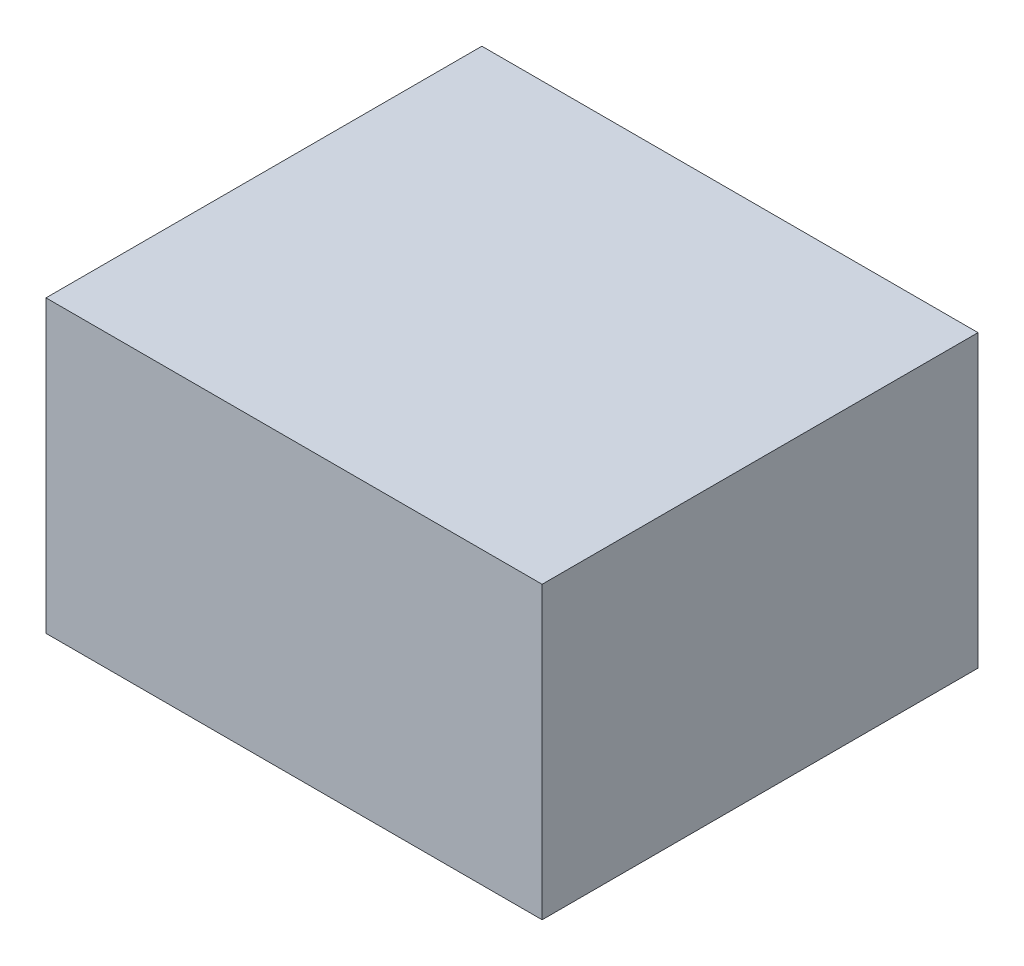
ISO-10303-21;
HEADER;
FILE_DESCRIPTION(('STEP AP214'),'2;1');
FILE_NAME('part.step','',(''),(''),'','','');
FILE_SCHEMA(('AUTOMOTIVE_DESIGN { 1 0 10303 214 1 1 1 1 }'));
ENDSEC;
DATA;
#1=APPLICATION_CONTEXT('core data for automotive mechanical design processes');
#2=APPLICATION_PROTOCOL_DEFINITION('international standard','automotive_design',2000,#1);
#3=PRODUCT_CONTEXT('',#1,'mechanical');
#4=PRODUCT('Part','Part','',(#3));
#5=PRODUCT_RELATED_PRODUCT_CATEGORY('part','',(#4));
#6=PRODUCT_DEFINITION_FORMATION('','',#4);
#7=PRODUCT_DEFINITION_CONTEXT('part definition',#1,'design');
#8=PRODUCT_DEFINITION('design','',#6,#7);
#9=PRODUCT_DEFINITION_SHAPE('','',#8);
#10=(LENGTH_UNIT() NAMED_UNIT(*) SI_UNIT(.MILLI.,.METRE.));
#11=(NAMED_UNIT(*) PLANE_ANGLE_UNIT() SI_UNIT($,.RADIAN.));
#12=(NAMED_UNIT(*) SI_UNIT($,.STERADIAN.) SOLID_ANGLE_UNIT());
#13=UNCERTAINTY_MEASURE_WITH_UNIT(LENGTH_MEASURE(1.E-05),#10,'distance_accuracy_value','');
#14=(GEOMETRIC_REPRESENTATION_CONTEXT(3) GLOBAL_UNCERTAINTY_ASSIGNED_CONTEXT((#13)) GLOBAL_UNIT_ASSIGNED_CONTEXT((#10,
#11,#12)) REPRESENTATION_CONTEXT('',''));
#15=CARTESIAN_POINT('',(0.,0.,0.));
#16=DIRECTION('',(0.,0.,1.));
#17=DIRECTION('',(1.,0.,0.));
#18=AXIS2_PLACEMENT_3D('',#15,#16,#17);
#19=CARTESIAN_POINT('',(-6.9999987,4.09999942,0.));
#20=DIRECTION('',(0.,1.,0.));
#21=DIRECTION('',(0.,0.,1.));
#22=AXIS2_PLACEMENT_3D('',#19,#20,#21);
#23=PLANE('',#22);
#24=DIRECTION('',(0.,0.,-1.));
#25=VECTOR('',#24,1.);
#26=CARTESIAN_POINT('',(7.00000124,4.09999942,0.));
#27=LINE('',#26,#25);
#28=CARTESIAN_POINT('',(7.00000124,4.09999942,0.));
#29=VERTEX_POINT('',#28);
#30=CARTESIAN_POINT('',(7.00000124,4.09999942,12.3000008));
#31=VERTEX_POINT('',#30);
#32=EDGE_CURVE('E19',#29,#31,#27,.F.);
#33=ORIENTED_EDGE('',*,*,#32,.F.);
#34=DIRECTION('',(1.,0.,0.));
#35=VECTOR('',#34,1.);
#36=CARTESIAN_POINT('',(7.00000124,4.09999942,0.));
#37=LINE('',#36,#35);
#38=CARTESIAN_POINT('',(-6.9999987,4.09999942,0.));
#39=VERTEX_POINT('',#38);
#40=EDGE_CURVE('E79',#29,#39,#37,.F.);
#41=ORIENTED_EDGE('',*,*,#40,.T.);
#42=DIRECTION('',(0.,0.,1.));
#43=VECTOR('',#42,1.);
#44=CARTESIAN_POINT('',(-6.9999987,4.09999942,0.));
#45=LINE('',#44,#43);
#46=CARTESIAN_POINT('',(-6.9999987,4.09999942,12.3000008));
#47=VERTEX_POINT('',#46);
#48=EDGE_CURVE('E67',#47,#39,#45,.F.);
#49=ORIENTED_EDGE('',*,*,#48,.F.);
#50=DIRECTION('',(1.,0.,0.));
#51=VECTOR('',#50,1.);
#52=CARTESIAN_POINT('',(7.00000124,4.09999942,12.3000008));
#53=LINE('',#52,#51);
#54=EDGE_CURVE('E55',#31,#47,#53,.F.);
#55=ORIENTED_EDGE('',*,*,#54,.F.);
#56=EDGE_LOOP('',(#33,#41,#49,#55));
#57=FACE_BOUND('',#56,.T.);
#58=ADVANCED_FACE('F16',(#57),#23,.T.);
#59=CARTESIAN_POINT('',(7.00000124,4.09999942,0.));
#60=DIRECTION('',(1.,0.,0.));
#61=DIRECTION('',(0.,0.,-1.));
#62=AXIS2_PLACEMENT_3D('',#59,#60,#61);
#63=PLANE('',#62);
#64=DIRECTION('',(0.,0.,-1.));
#65=VECTOR('',#64,1.);
#66=CARTESIAN_POINT('',(7.00000124,-4.09999942,0.));
#67=LINE('',#66,#65);
#68=CARTESIAN_POINT('',(7.00000124,-4.09999942,0.));
#69=VERTEX_POINT('',#68);
#70=CARTESIAN_POINT('',(7.00000124,-4.09999942,12.3000008));
#71=VERTEX_POINT('',#70);
#72=EDGE_CURVE('E82',#69,#71,#67,.F.);
#73=ORIENTED_EDGE('',*,*,#72,.F.);
#74=DIRECTION('',(0.,1.,0.));
#75=VECTOR('',#74,1.);
#76=CARTESIAN_POINT('',(7.00000124,-4.09999942,0.));
#77=LINE('',#76,#75);
#78=EDGE_CURVE('E64',#69,#29,#77,.T.);
#79=ORIENTED_EDGE('',*,*,#78,.T.);
#80=ORIENTED_EDGE('',*,*,#32,.T.);
#81=DIRECTION('',(0.,1.,0.));
#82=VECTOR('',#81,1.);
#83=CARTESIAN_POINT('',(7.00000124,-4.09999942,12.3000008));
#84=LINE('',#83,#82);
#85=EDGE_CURVE('E61',#71,#31,#84,.T.);
#86=ORIENTED_EDGE('',*,*,#85,.F.);
#87=EDGE_LOOP('',(#73,#79,#80,#86));
#88=FACE_BOUND('',#87,.T.);
#89=ADVANCED_FACE('F60',(#88),#63,.T.);
#90=CARTESIAN_POINT('',(7.00000124,-4.09999942,12.3000008));
#91=DIRECTION('',(0.,0.,1.));
#92=DIRECTION('',(1.,0.,0.));
#93=AXIS2_PLACEMENT_3D('',#90,#91,#92);
#94=PLANE('',#93);
#95=DIRECTION('',(0.,1.,0.));
#96=VECTOR('',#95,1.);
#97=CARTESIAN_POINT('',(-6.9999987,-4.09999942,12.3000008));
#98=LINE('',#97,#96);
#99=CARTESIAN_POINT('',(-6.9999987,-4.09999942,12.3000008));
#100=VERTEX_POINT('',#99);
#101=EDGE_CURVE('E69',#100,#47,#98,.T.);
#102=ORIENTED_EDGE('',*,*,#101,.F.);
#103=DIRECTION('',(1.,0.,0.));
#104=VECTOR('',#103,1.);
#105=CARTESIAN_POINT('',(7.00000124,-4.09999942,12.3000008));
#106=LINE('',#105,#104);
#107=EDGE_CURVE('E73',#71,#100,#106,.F.);
#108=ORIENTED_EDGE('',*,*,#107,.F.);
#109=ORIENTED_EDGE('',*,*,#85,.T.);
#110=ORIENTED_EDGE('',*,*,#54,.T.);
#111=EDGE_LOOP('',(#102,#108,#109,#110));
#112=FACE_BOUND('',#111,.T.);
#113=ADVANCED_FACE('F71',(#112),#94,.T.);
#114=CARTESIAN_POINT('',(-6.9999987,-4.09999942,0.));
#115=DIRECTION('',(-1.,0.,0.));
#116=DIRECTION('',(0.,0.,1.));
#117=AXIS2_PLACEMENT_3D('',#114,#115,#116);
#118=PLANE('',#117);
#119=ORIENTED_EDGE('',*,*,#48,.T.);
#120=DIRECTION('',(0.,1.,0.));
#121=VECTOR('',#120,1.);
#122=CARTESIAN_POINT('',(-6.9999987,-4.09999942,0.));
#123=LINE('',#122,#121);
#124=CARTESIAN_POINT('',(-6.9999987,-4.09999942,0.));
#125=VERTEX_POINT('',#124);
#126=EDGE_CURVE('E34',#39,#125,#123,.F.);
#127=ORIENTED_EDGE('',*,*,#126,.T.);
#128=DIRECTION('',(0.,0.,-1.));
#129=VECTOR('',#128,1.);
#130=CARTESIAN_POINT('',(-6.9999987,-4.09999942,0.));
#131=LINE('',#130,#129);
#132=EDGE_CURVE('E25',#100,#125,#131,.T.);
#133=ORIENTED_EDGE('',*,*,#132,.F.);
#134=ORIENTED_EDGE('',*,*,#101,.T.);
#135=EDGE_LOOP('',(#119,#127,#133,#134));
#136=FACE_BOUND('',#135,.T.);
#137=ADVANCED_FACE('F88',(#136),#118,.T.);
#138=CARTESIAN_POINT('',(7.00000124,-4.09999942,0.));
#139=DIRECTION('',(0.,0.,1.));
#140=DIRECTION('',(1.,0.,0.));
#141=AXIS2_PLACEMENT_3D('',#138,#139,#140);
#142=PLANE('',#141);
#143=ORIENTED_EDGE('',*,*,#126,.F.);
#144=ORIENTED_EDGE('',*,*,#40,.F.);
#145=ORIENTED_EDGE('',*,*,#78,.F.);
#146=DIRECTION('',(1.,0.,0.));
#147=VECTOR('',#146,1.);
#148=CARTESIAN_POINT('',(7.00000124,-4.09999942,0.));
#149=LINE('',#148,#147);
#150=EDGE_CURVE('E11',#125,#69,#149,.T.);
#151=ORIENTED_EDGE('',*,*,#150,.F.);
#152=EDGE_LOOP('',(#143,#144,#145,#151));
#153=FACE_BOUND('',#152,.T.);
#154=ADVANCED_FACE('F90',(#153),#142,.F.);
#155=CARTESIAN_POINT('',(7.00000124,-4.09999942,0.));
#156=DIRECTION('',(0.,-1.,0.));
#157=DIRECTION('',(0.,0.,-1.));
#158=AXIS2_PLACEMENT_3D('',#155,#156,#157);
#159=PLANE('',#158);
#160=ORIENTED_EDGE('',*,*,#132,.T.);
#161=ORIENTED_EDGE('',*,*,#150,.T.);
#162=ORIENTED_EDGE('',*,*,#72,.T.);
#163=ORIENTED_EDGE('',*,*,#107,.T.);
#164=EDGE_LOOP('',(#160,#161,#162,#163));
#165=FACE_BOUND('',#164,.T.);
#166=ADVANCED_FACE('F87',(#165),#159,.T.);
#167=CLOSED_SHELL('',(#58,#89,#113,#137,#154,#166));
#168=MANIFOLD_SOLID_BREP('B1',#167);
#169=ADVANCED_BREP_SHAPE_REPRESENTATION('',(#18,#168),#14);
#170=SHAPE_DEFINITION_REPRESENTATION(#9,#169);
ENDSEC;
END-ISO-10303-21;
